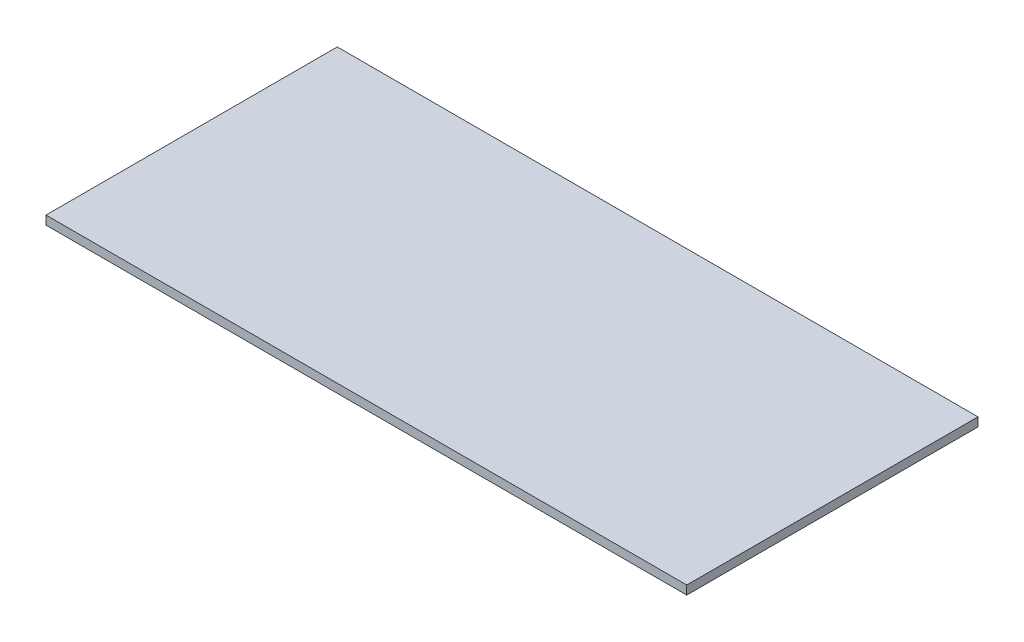
ISO-10303-21;
HEADER;
FILE_DESCRIPTION(('STEP AP214'),'2;1');
FILE_NAME('part.step','',(''),(''),'','','');
FILE_SCHEMA(('AUTOMOTIVE_DESIGN { 1 0 10303 214 1 1 1 1 }'));
ENDSEC;
DATA;
#1=APPLICATION_CONTEXT('core data for automotive mechanical design processes');
#2=APPLICATION_PROTOCOL_DEFINITION('international standard','automotive_design',2000,#1);
#3=PRODUCT_CONTEXT('',#1,'mechanical');
#4=PRODUCT('Part','Part','',(#3));
#5=PRODUCT_RELATED_PRODUCT_CATEGORY('part','',(#4));
#6=PRODUCT_DEFINITION_FORMATION('','',#4);
#7=PRODUCT_DEFINITION_CONTEXT('part definition',#1,'design');
#8=PRODUCT_DEFINITION('design','',#6,#7);
#9=PRODUCT_DEFINITION_SHAPE('','',#8);
#10=(LENGTH_UNIT() NAMED_UNIT(*) SI_UNIT(.MILLI.,.METRE.));
#11=(NAMED_UNIT(*) PLANE_ANGLE_UNIT() SI_UNIT($,.RADIAN.));
#12=(NAMED_UNIT(*) SI_UNIT($,.STERADIAN.) SOLID_ANGLE_UNIT());
#13=UNCERTAINTY_MEASURE_WITH_UNIT(LENGTH_MEASURE(1.E-05),#10,'distance_accuracy_value','');
#14=(GEOMETRIC_REPRESENTATION_CONTEXT(3) GLOBAL_UNCERTAINTY_ASSIGNED_CONTEXT((#13)) GLOBAL_UNIT_ASSIGNED_CONTEXT((#10,
#11,#12)) REPRESENTATION_CONTEXT('',''));
#15=CARTESIAN_POINT('',(0.,0.,0.));
#16=DIRECTION('',(0.,0.,1.));
#17=DIRECTION('',(1.,0.,0.));
#18=AXIS2_PLACEMENT_3D('',#15,#16,#17);
#19=CARTESIAN_POINT('',(0.,3.,0.));
#20=DIRECTION('',(1.,0.,0.));
#21=DIRECTION('',(0.,0.,-1.));
#22=AXIS2_PLACEMENT_3D('',#19,#20,#21);
#23=PLANE('',#22);
#24=DIRECTION('',(0.,0.,1.));
#25=VECTOR('',#24,1.);
#26=CARTESIAN_POINT('',(0.,0.,0.));
#27=LINE('',#26,#25);
#28=CARTESIAN_POINT('',(0.,0.,-100.));
#29=VERTEX_POINT('',#28);
#30=CARTESIAN_POINT('',(0.,0.,0.));
#31=VERTEX_POINT('',#30);
#32=EDGE_CURVE('E98',#29,#31,#27,.T.);
#33=ORIENTED_EDGE('',*,*,#32,.T.);
#34=DIRECTION('',(0.,-1.,0.));
#35=VECTOR('',#34,1.);
#36=CARTESIAN_POINT('',(0.,3.,0.));
#37=LINE('',#36,#35);
#38=CARTESIAN_POINT('',(0.,3.,0.));
#39=VERTEX_POINT('',#38);
#40=EDGE_CURVE('E11',#39,#31,#37,.T.);
#41=ORIENTED_EDGE('',*,*,#40,.F.);
#42=DIRECTION('',(0.,0.,1.));
#43=VECTOR('',#42,1.);
#44=CARTESIAN_POINT('',(0.,3.,0.));
#45=LINE('',#44,#43);
#46=CARTESIAN_POINT('',(0.,3.,-100.));
#47=VERTEX_POINT('',#46);
#48=EDGE_CURVE('E86',#47,#39,#45,.T.);
#49=ORIENTED_EDGE('',*,*,#48,.F.);
#50=DIRECTION('',(0.,-1.,0.));
#51=VECTOR('',#50,1.);
#52=CARTESIAN_POINT('',(0.,3.,-100.));
#53=LINE('',#52,#51);
#54=EDGE_CURVE('E94',#47,#29,#53,.T.);
#55=ORIENTED_EDGE('',*,*,#54,.T.);
#56=EDGE_LOOP('',(#33,#41,#49,#55));
#57=FACE_BOUND('',#56,.T.);
#58=ADVANCED_FACE('F35',(#57),#23,.F.);
#59=CARTESIAN_POINT('',(0.,3.,0.));
#60=DIRECTION('',(0.,0.,-1.));
#61=DIRECTION('',(-1.,0.,0.));
#62=AXIS2_PLACEMENT_3D('',#59,#60,#61);
#63=PLANE('',#62);
#64=DIRECTION('',(1.,0.,0.));
#65=VECTOR('',#64,1.);
#66=CARTESIAN_POINT('',(0.,0.,0.));
#67=LINE('',#66,#65);
#68=CARTESIAN_POINT('',(220.,0.,0.));
#69=VERTEX_POINT('',#68);
#70=EDGE_CURVE('E90',#31,#69,#67,.T.);
#71=ORIENTED_EDGE('',*,*,#70,.T.);
#72=DIRECTION('',(0.,-1.,0.));
#73=VECTOR('',#72,1.);
#74=CARTESIAN_POINT('',(220.,3.,0.));
#75=LINE('',#74,#73);
#76=CARTESIAN_POINT('',(220.,3.,0.));
#77=VERTEX_POINT('',#76);
#78=EDGE_CURVE('E43',#77,#69,#75,.T.);
#79=ORIENTED_EDGE('',*,*,#78,.F.);
#80=DIRECTION('',(1.,0.,0.));
#81=VECTOR('',#80,1.);
#82=CARTESIAN_POINT('',(0.,3.,0.));
#83=LINE('',#82,#81);
#84=EDGE_CURVE('E81',#39,#77,#83,.T.);
#85=ORIENTED_EDGE('',*,*,#84,.F.);
#86=ORIENTED_EDGE('',*,*,#40,.T.);
#87=EDGE_LOOP('',(#71,#79,#85,#86));
#88=FACE_BOUND('',#87,.T.);
#89=ADVANCED_FACE('F89',(#88),#63,.F.);
#90=CARTESIAN_POINT('',(220.,3.,0.));
#91=DIRECTION('',(-1.,0.,0.));
#92=DIRECTION('',(0.,0.,1.));
#93=AXIS2_PLACEMENT_3D('',#90,#91,#92);
#94=PLANE('',#93);
#95=DIRECTION('',(0.,0.,-1.));
#96=VECTOR('',#95,1.);
#97=CARTESIAN_POINT('',(220.,0.,0.));
#98=LINE('',#97,#96);
#99=CARTESIAN_POINT('',(220.,0.,-100.));
#100=VERTEX_POINT('',#99);
#101=EDGE_CURVE('E68',#69,#100,#98,.T.);
#102=ORIENTED_EDGE('',*,*,#101,.T.);
#103=DIRECTION('',(0.,-1.,0.));
#104=VECTOR('',#103,1.);
#105=CARTESIAN_POINT('',(220.,3.,-100.));
#106=LINE('',#105,#104);
#107=CARTESIAN_POINT('',(220.,3.,-100.));
#108=VERTEX_POINT('',#107);
#109=EDGE_CURVE('E91',#108,#100,#106,.T.);
#110=ORIENTED_EDGE('',*,*,#109,.F.);
#111=DIRECTION('',(0.,0.,-1.));
#112=VECTOR('',#111,1.);
#113=CARTESIAN_POINT('',(220.,3.,0.));
#114=LINE('',#113,#112);
#115=EDGE_CURVE('E84',#77,#108,#114,.T.);
#116=ORIENTED_EDGE('',*,*,#115,.F.);
#117=ORIENTED_EDGE('',*,*,#78,.T.);
#118=EDGE_LOOP('',(#102,#110,#116,#117));
#119=FACE_BOUND('',#118,.T.);
#120=ADVANCED_FACE('F92',(#119),#94,.F.);
#121=CARTESIAN_POINT('',(0.,3.,-100.));
#122=DIRECTION('',(0.,0.,1.));
#123=DIRECTION('',(1.,0.,0.));
#124=AXIS2_PLACEMENT_3D('',#121,#122,#123);
#125=PLANE('',#124);
#126=DIRECTION('',(-1.,0.,0.));
#127=VECTOR('',#126,1.);
#128=CARTESIAN_POINT('',(0.,0.,-100.));
#129=LINE('',#128,#127);
#130=EDGE_CURVE('E74',#100,#29,#129,.T.);
#131=ORIENTED_EDGE('',*,*,#130,.T.);
#132=ORIENTED_EDGE('',*,*,#54,.F.);
#133=DIRECTION('',(-1.,0.,0.));
#134=VECTOR('',#133,1.);
#135=CARTESIAN_POINT('',(0.,3.,-100.));
#136=LINE('',#135,#134);
#137=EDGE_CURVE('E51',#108,#47,#136,.T.);
#138=ORIENTED_EDGE('',*,*,#137,.F.);
#139=ORIENTED_EDGE('',*,*,#109,.T.);
#140=EDGE_LOOP('',(#131,#132,#138,#139));
#141=FACE_BOUND('',#140,.T.);
#142=ADVANCED_FACE('F105',(#141),#125,.F.);
#143=CARTESIAN_POINT('',(0.,3.,0.));
#144=DIRECTION('',(0.,-1.,0.));
#145=DIRECTION('',(0.,0.,-1.));
#146=AXIS2_PLACEMENT_3D('',#143,#144,#145);
#147=PLANE('',#146);
#148=ORIENTED_EDGE('',*,*,#48,.T.);
#149=ORIENTED_EDGE('',*,*,#84,.T.);
#150=ORIENTED_EDGE('',*,*,#115,.T.);
#151=ORIENTED_EDGE('',*,*,#137,.T.);
#152=EDGE_LOOP('',(#148,#149,#150,#151));
#153=FACE_BOUND('',#152,.T.);
#154=ADVANCED_FACE('F82',(#153),#147,.F.);
#155=CARTESIAN_POINT('',(0.,0.,0.));
#156=DIRECTION('',(0.,-1.,0.));
#157=DIRECTION('',(0.,0.,-1.));
#158=AXIS2_PLACEMENT_3D('',#155,#156,#157);
#159=PLANE('',#158);
#160=ORIENTED_EDGE('',*,*,#32,.F.);
#161=ORIENTED_EDGE('',*,*,#130,.F.);
#162=ORIENTED_EDGE('',*,*,#101,.F.);
#163=ORIENTED_EDGE('',*,*,#70,.F.);
#164=EDGE_LOOP('',(#160,#161,#162,#163));
#165=FACE_BOUND('',#164,.T.);
#166=ADVANCED_FACE('F108',(#165),#159,.T.);
#167=CLOSED_SHELL('',(#58,#89,#120,#142,#154,#166));
#168=MANIFOLD_SOLID_BREP('B2',#167);
#169=ADVANCED_BREP_SHAPE_REPRESENTATION('',(#18,#168),#14);
#170=SHAPE_DEFINITION_REPRESENTATION(#9,#169);
ENDSEC;
END-ISO-10303-21;
